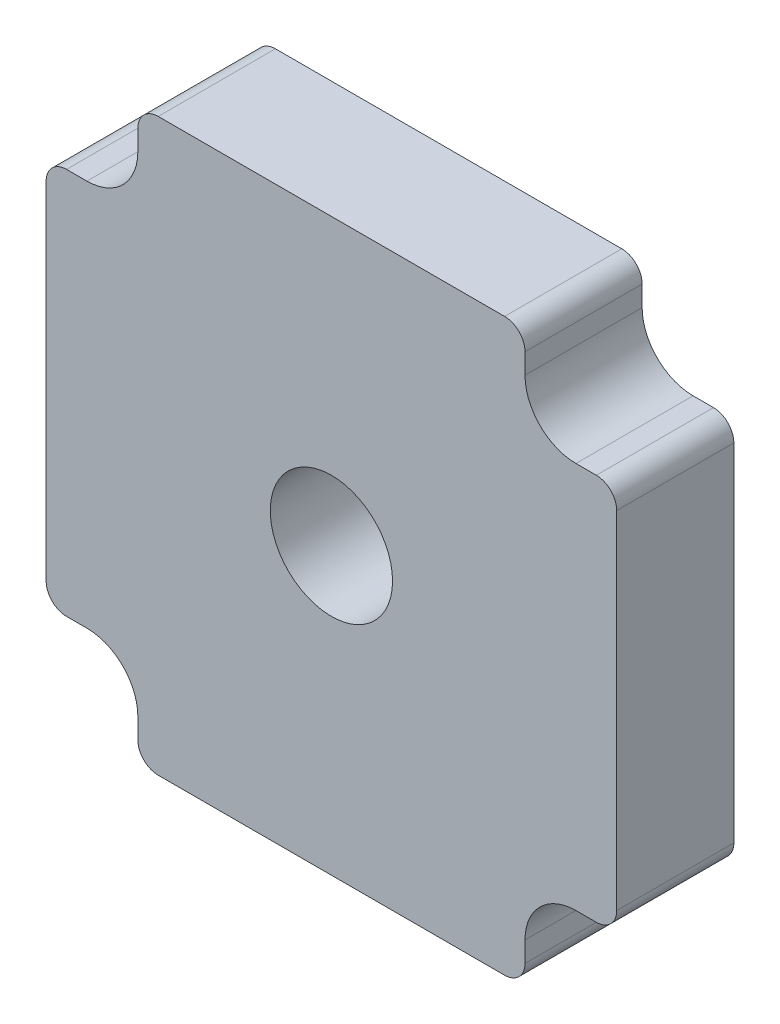
ISO-10303-21;
HEADER;
FILE_DESCRIPTION(('STEP AP214'),'2;1');
FILE_NAME('part.step','',(''),(''),'','','');
FILE_SCHEMA(('AUTOMOTIVE_DESIGN { 1 0 10303 214 1 1 1 1 }'));
ENDSEC;
DATA;
#1=APPLICATION_CONTEXT('core data for automotive mechanical design processes');
#2=APPLICATION_PROTOCOL_DEFINITION('international standard','automotive_design',2000,#1);
#3=PRODUCT_CONTEXT('',#1,'mechanical');
#4=PRODUCT('Part','Part','',(#3));
#5=PRODUCT_RELATED_PRODUCT_CATEGORY('part','',(#4));
#6=PRODUCT_DEFINITION_FORMATION('','',#4);
#7=PRODUCT_DEFINITION_CONTEXT('part definition',#1,'design');
#8=PRODUCT_DEFINITION('design','',#6,#7);
#9=PRODUCT_DEFINITION_SHAPE('','',#8);
#10=(LENGTH_UNIT() NAMED_UNIT(*) SI_UNIT(.MILLI.,.METRE.));
#11=(NAMED_UNIT(*) PLANE_ANGLE_UNIT() SI_UNIT($,.RADIAN.));
#12=(NAMED_UNIT(*) SI_UNIT($,.STERADIAN.) SOLID_ANGLE_UNIT());
#13=UNCERTAINTY_MEASURE_WITH_UNIT(LENGTH_MEASURE(1.E-05),#10,'distance_accuracy_value','');
#14=(GEOMETRIC_REPRESENTATION_CONTEXT(3) GLOBAL_UNCERTAINTY_ASSIGNED_CONTEXT((#13)) GLOBAL_UNIT_ASSIGNED_CONTEXT((#10,
#11,#12)) REPRESENTATION_CONTEXT('',''));
#15=CARTESIAN_POINT('',(0.,0.,0.));
#16=DIRECTION('',(0.,0.,1.));
#17=DIRECTION('',(1.,0.,0.));
#18=AXIS2_PLACEMENT_3D('',#15,#16,#17);
#19=CARTESIAN_POINT('',(-28.,-28.,11.5));
#20=DIRECTION('',(1.,0.,0.));
#21=DIRECTION('',(0.,0.,-1.));
#22=AXIS2_PLACEMENT_3D('',#19,#20,#21);
#23=PLANE('',#22);
#24=DIRECTION('',(0.,-1.,0.));
#25=VECTOR('',#24,1.);
#26=CARTESIAN_POINT('',(-28.,-28.,11.5));
#27=LINE('',#26,#25);
#28=CARTESIAN_POINT('',(-28.,16.9999999999999,11.5));
#29=VERTEX_POINT('',#28);
#30=CARTESIAN_POINT('',(-28.,-17.,11.5));
#31=VERTEX_POINT('',#30);
#32=EDGE_CURVE('E242',#29,#31,#27,.T.);
#33=ORIENTED_EDGE('',*,*,#32,.F.);
#34=DIRECTION('',(0.,0.,1.));
#35=VECTOR('',#34,1.);
#36=CARTESIAN_POINT('',(-28.,16.9999999999999,11.5));
#37=LINE('',#36,#35);
#38=CARTESIAN_POINT('',(-28.,16.9999999999999,0.));
#39=VERTEX_POINT('',#38);
#40=EDGE_CURVE('E317',#29,#39,#37,.F.);
#41=ORIENTED_EDGE('',*,*,#40,.T.);
#42=DIRECTION('',(0.,-1.,0.));
#43=VECTOR('',#42,1.);
#44=CARTESIAN_POINT('',(-28.,-28.,0.));
#45=LINE('',#44,#43);
#46=CARTESIAN_POINT('',(-28.,-17.,0.));
#47=VERTEX_POINT('',#46);
#48=EDGE_CURVE('E237',#39,#47,#45,.T.);
#49=ORIENTED_EDGE('',*,*,#48,.T.);
#50=DIRECTION('',(0.,0.,1.));
#51=VECTOR('',#50,1.);
#52=CARTESIAN_POINT('',(-28.,-17.,11.5));
#53=LINE('',#52,#51);
#54=EDGE_CURVE('E314',#47,#31,#53,.T.);
#55=ORIENTED_EDGE('',*,*,#54,.T.);
#56=EDGE_LOOP('',(#33,#41,#49,#55));
#57=FACE_BOUND('',#56,.T.);
#58=ADVANCED_FACE('F33',(#57),#23,.F.);
#59=CARTESIAN_POINT('',(28.,-28.,11.5));
#60=DIRECTION('',(0.,1.,0.));
#61=DIRECTION('',(-1.,0.,0.));
#62=AXIS2_PLACEMENT_3D('',#59,#60,#61);
#63=PLANE('',#62);
#64=DIRECTION('',(1.,0.,0.));
#65=VECTOR('',#64,1.);
#66=CARTESIAN_POINT('',(28.,-28.,11.5));
#67=LINE('',#66,#65);
#68=CARTESIAN_POINT('',(-17.,-28.,11.5));
#69=VERTEX_POINT('',#68);
#70=CARTESIAN_POINT('',(17.0000000000003,-28.,11.5));
#71=VERTEX_POINT('',#70);
#72=EDGE_CURVE('E245',#69,#71,#67,.T.);
#73=ORIENTED_EDGE('',*,*,#72,.F.);
#74=DIRECTION('',(0.,0.,1.));
#75=VECTOR('',#74,1.);
#76=CARTESIAN_POINT('',(-17.,-28.,11.5));
#77=LINE('',#76,#75);
#78=CARTESIAN_POINT('',(-17.,-28.,0.));
#79=VERTEX_POINT('',#78);
#80=EDGE_CURVE('E55',#69,#79,#77,.F.);
#81=ORIENTED_EDGE('',*,*,#80,.T.);
#82=DIRECTION('',(1.,0.,0.));
#83=VECTOR('',#82,1.);
#84=CARTESIAN_POINT('',(28.,-28.,0.));
#85=LINE('',#84,#83);
#86=CARTESIAN_POINT('',(17.0000000000003,-28.,0.));
#87=VERTEX_POINT('',#86);
#88=EDGE_CURVE('E255',#79,#87,#85,.T.);
#89=ORIENTED_EDGE('',*,*,#88,.T.);
#90=DIRECTION('',(0.,0.,1.));
#91=VECTOR('',#90,1.);
#92=CARTESIAN_POINT('',(17.0000000000003,-28.,11.5));
#93=LINE('',#92,#91);
#94=EDGE_CURVE('E344',#87,#71,#93,.T.);
#95=ORIENTED_EDGE('',*,*,#94,.T.);
#96=EDGE_LOOP('',(#73,#81,#89,#95));
#97=FACE_BOUND('',#96,.T.);
#98=ADVANCED_FACE('F434',(#97),#63,.F.);
#99=CARTESIAN_POINT('',(28.,-28.,11.5));
#100=DIRECTION('',(-1.,0.,0.));
#101=DIRECTION('',(0.,0.,1.));
#102=AXIS2_PLACEMENT_3D('',#99,#100,#101);
#103=PLANE('',#102);
#104=DIRECTION('',(0.,1.,0.));
#105=VECTOR('',#104,1.);
#106=CARTESIAN_POINT('',(28.,-28.,11.5));
#107=LINE('',#106,#105);
#108=CARTESIAN_POINT('',(28.,-16.9999999999997,11.5));
#109=VERTEX_POINT('',#108);
#110=CARTESIAN_POINT('',(28.,17.,11.5));
#111=VERTEX_POINT('',#110);
#112=EDGE_CURVE('E249',#109,#111,#107,.T.);
#113=ORIENTED_EDGE('',*,*,#112,.F.);
#114=DIRECTION('',(0.,0.,1.));
#115=VECTOR('',#114,1.);
#116=CARTESIAN_POINT('',(28.,-16.9999999999997,11.5));
#117=LINE('',#116,#115);
#118=CARTESIAN_POINT('',(28.,-16.9999999999997,0.));
#119=VERTEX_POINT('',#118);
#120=EDGE_CURVE('E358',#109,#119,#117,.F.);
#121=ORIENTED_EDGE('',*,*,#120,.T.);
#122=DIRECTION('',(0.,1.,0.));
#123=VECTOR('',#122,1.);
#124=CARTESIAN_POINT('',(28.,-28.,0.));
#125=LINE('',#124,#123);
#126=CARTESIAN_POINT('',(28.,17.,0.));
#127=VERTEX_POINT('',#126);
#128=EDGE_CURVE('E257',#119,#127,#125,.T.);
#129=ORIENTED_EDGE('',*,*,#128,.T.);
#130=DIRECTION('',(0.,0.,1.));
#131=VECTOR('',#130,1.);
#132=CARTESIAN_POINT('',(28.,17.,11.5));
#133=LINE('',#132,#131);
#134=EDGE_CURVE('E355',#127,#111,#133,.T.);
#135=ORIENTED_EDGE('',*,*,#134,.T.);
#136=EDGE_LOOP('',(#113,#121,#129,#135));
#137=FACE_BOUND('',#136,.T.);
#138=ADVANCED_FACE('F375',(#137),#103,.F.);
#139=CARTESIAN_POINT('',(28.,28.,11.5));
#140=DIRECTION('',(0.,-1.,0.));
#141=DIRECTION('',(1.,0.,0.));
#142=AXIS2_PLACEMENT_3D('',#139,#140,#141);
#143=PLANE('',#142);
#144=DIRECTION('',(-1.,0.,0.));
#145=VECTOR('',#144,1.);
#146=CARTESIAN_POINT('',(28.,28.,0.));
#147=LINE('',#146,#145);
#148=CARTESIAN_POINT('',(17.,28.,0.));
#149=VERTEX_POINT('',#148);
#150=CARTESIAN_POINT('',(-17.0000000000001,28.,0.));
#151=VERTEX_POINT('',#150);
#152=EDGE_CURVE('E246',#149,#151,#147,.T.);
#153=ORIENTED_EDGE('',*,*,#152,.T.);
#154=DIRECTION('',(0.,0.,1.));
#155=VECTOR('',#154,1.);
#156=CARTESIAN_POINT('',(-17.0000000000001,28.,11.5));
#157=LINE('',#156,#155);
#158=CARTESIAN_POINT('',(-17.0000000000001,28.,11.5));
#159=VERTEX_POINT('',#158);
#160=EDGE_CURVE('E336',#151,#159,#157,.T.);
#161=ORIENTED_EDGE('',*,*,#160,.T.);
#162=DIRECTION('',(-1.,0.,0.));
#163=VECTOR('',#162,1.);
#164=CARTESIAN_POINT('',(28.,28.,11.5));
#165=LINE('',#164,#163);
#166=CARTESIAN_POINT('',(17.,28.,11.5));
#167=VERTEX_POINT('',#166);
#168=EDGE_CURVE('E218',#167,#159,#165,.T.);
#169=ORIENTED_EDGE('',*,*,#168,.F.);
#170=DIRECTION('',(0.,0.,1.));
#171=VECTOR('',#170,1.);
#172=CARTESIAN_POINT('',(17.,28.,11.5));
#173=LINE('',#172,#171);
#174=EDGE_CURVE('E334',#167,#149,#173,.F.);
#175=ORIENTED_EDGE('',*,*,#174,.T.);
#176=EDGE_LOOP('',(#153,#161,#169,#175));
#177=FACE_BOUND('',#176,.T.);
#178=ADVANCED_FACE('F408',(#177),#143,.F.);
#179=CARTESIAN_POINT('',(0.,0.,11.5));
#180=DIRECTION('',(0.,0.,1.));
#181=DIRECTION('',(1.,0.,0.));
#182=AXIS2_PLACEMENT_3D('',#179,#180,#181);
#183=PLANE('',#182);
#184=CARTESIAN_POINT('',(0.,0.,11.5));
#185=DIRECTION('',(0.,0.,1.));
#186=DIRECTION('',(1.,0.,0.));
#187=AXIS2_PLACEMENT_3D('',#184,#185,#186);
#188=CIRCLE('',#187,6.);
#189=CARTESIAN_POINT('',(6.,0.,11.5));
#190=VERTEX_POINT('',#189);
#191=EDGE_CURVE('E648',#190,#190,#188,.T.);
#192=ORIENTED_EDGE('',*,*,#191,.F.);
#193=EDGE_LOOP('',(#192));
#194=FACE_BOUND('',#193,.T.);
#195=DIRECTION('',(1.,0.,0.));
#196=VECTOR('',#195,1.);
#197=CARTESIAN_POINT('',(-28.0000000000001,18.9999999999999,11.5));
#198=LINE('',#197,#196);
#199=CARTESIAN_POINT('',(-26.,18.9999999999999,11.5));
#200=VERTEX_POINT('',#199);
#201=CARTESIAN_POINT('',(-24.0000000000001,18.9999999999999,11.5));
#202=VERTEX_POINT('',#201);
#203=EDGE_CURVE('E224',#200,#202,#198,.T.);
#204=ORIENTED_EDGE('',*,*,#203,.F.);
#205=CARTESIAN_POINT('',(-26.,16.9999999999999,11.5));
#206=DIRECTION('',(0.,0.,1.));
#207=DIRECTION('',(1.,0.,0.));
#208=AXIS2_PLACEMENT_3D('',#205,#206,#207);
#209=CIRCLE('',#208,2.);
#210=EDGE_CURVE('E312',#200,#29,#209,.T.);
#211=ORIENTED_EDGE('',*,*,#210,.T.);
#212=ORIENTED_EDGE('',*,*,#32,.T.);
#213=CARTESIAN_POINT('',(-26.,-17.,11.5));
#214=DIRECTION('',(0.,0.,1.));
#215=DIRECTION('',(1.,0.,0.));
#216=AXIS2_PLACEMENT_3D('',#213,#214,#215);
#217=CIRCLE('',#216,2.);
#218=CARTESIAN_POINT('',(-26.,-19.,11.5));
#219=VERTEX_POINT('',#218);
#220=EDGE_CURVE('E307',#31,#219,#217,.T.);
#221=ORIENTED_EDGE('',*,*,#220,.T.);
#222=DIRECTION('',(-1.,0.,0.));
#223=VECTOR('',#222,1.);
#224=CARTESIAN_POINT('',(-19.,-19.,11.5));
#225=LINE('',#224,#223);
#226=CARTESIAN_POINT('',(-24.,-19.,11.5));
#227=VERTEX_POINT('',#226);
#228=EDGE_CURVE('E397',#227,#219,#225,.T.);
#229=ORIENTED_EDGE('',*,*,#228,.F.);
#230=CARTESIAN_POINT('',(-24.,-24.,11.5));
#231=DIRECTION('',(0.,0.,1.));
#232=DIRECTION('',(1.,0.,0.));
#233=AXIS2_PLACEMENT_3D('',#230,#231,#232);
#234=CIRCLE('',#233,5.);
#235=CARTESIAN_POINT('',(-19.,-24.,11.5));
#236=VERTEX_POINT('',#235);
#237=EDGE_CURVE('E281',#227,#236,#234,.F.);
#238=ORIENTED_EDGE('',*,*,#237,.T.);
#239=DIRECTION('',(0.,1.,0.));
#240=VECTOR('',#239,1.);
#241=CARTESIAN_POINT('',(-19.,-28.,11.5));
#242=LINE('',#241,#240);
#243=CARTESIAN_POINT('',(-19.,-26.,11.5));
#244=VERTEX_POINT('',#243);
#245=EDGE_CURVE('E392',#244,#236,#242,.T.);
#246=ORIENTED_EDGE('',*,*,#245,.F.);
#247=CARTESIAN_POINT('',(-17.,-26.,11.5));
#248=DIRECTION('',(0.,0.,1.));
#249=DIRECTION('',(1.,0.,0.));
#250=AXIS2_PLACEMENT_3D('',#247,#248,#249);
#251=CIRCLE('',#250,2.);
#252=EDGE_CURVE('E309',#244,#69,#251,.T.);
#253=ORIENTED_EDGE('',*,*,#252,.T.);
#254=ORIENTED_EDGE('',*,*,#72,.T.);
#255=CARTESIAN_POINT('',(17.0000000000003,-26.,11.5));
#256=DIRECTION('',(0.,0.,1.));
#257=DIRECTION('',(1.,0.,0.));
#258=AXIS2_PLACEMENT_3D('',#255,#256,#257);
#259=CIRCLE('',#258,2.);
#260=CARTESIAN_POINT('',(19.0000000000003,-26.,11.5));
#261=VERTEX_POINT('',#260);
#262=EDGE_CURVE('E305',#71,#261,#259,.T.);
#263=ORIENTED_EDGE('',*,*,#262,.T.);
#264=DIRECTION('',(0.,-1.,0.));
#265=VECTOR('',#264,1.);
#266=CARTESIAN_POINT('',(19.0000000000002,-18.9999999999998,11.5));
#267=LINE('',#266,#265);
#268=CARTESIAN_POINT('',(19.0000000000002,-23.9999999999998,11.5));
#269=VERTEX_POINT('',#268);
#270=EDGE_CURVE('E390',#269,#261,#267,.T.);
#271=ORIENTED_EDGE('',*,*,#270,.F.);
#272=CARTESIAN_POINT('',(24.0000000000002,-23.9999999999998,11.5));
#273=DIRECTION('',(0.,0.,1.));
#274=DIRECTION('',(1.,0.,0.));
#275=AXIS2_PLACEMENT_3D('',#272,#273,#274);
#276=CIRCLE('',#275,5.);
#277=CARTESIAN_POINT('',(24.0000000000002,-18.9999999999998,11.5));
#278=VERTEX_POINT('',#277);
#279=EDGE_CURVE('E286',#269,#278,#276,.F.);
#280=ORIENTED_EDGE('',*,*,#279,.T.);
#281=DIRECTION('',(-1.,0.,0.));
#282=VECTOR('',#281,1.);
#283=CARTESIAN_POINT('',(28.0000000000002,-18.9999999999997,11.5));
#284=LINE('',#283,#282);
#285=CARTESIAN_POINT('',(26.,-18.9999999999997,11.5));
#286=VERTEX_POINT('',#285);
#287=EDGE_CURVE('E378',#286,#278,#284,.T.);
#288=ORIENTED_EDGE('',*,*,#287,.F.);
#289=CARTESIAN_POINT('',(26.,-16.9999999999997,11.5));
#290=DIRECTION('',(0.,0.,1.));
#291=DIRECTION('',(1.,0.,0.));
#292=AXIS2_PLACEMENT_3D('',#289,#290,#291);
#293=CIRCLE('',#292,2.);
#294=EDGE_CURVE('E303',#286,#109,#293,.T.);
#295=ORIENTED_EDGE('',*,*,#294,.T.);
#296=ORIENTED_EDGE('',*,*,#112,.T.);
#297=CARTESIAN_POINT('',(26.,17.,11.5));
#298=DIRECTION('',(0.,0.,1.));
#299=DIRECTION('',(1.,0.,0.));
#300=AXIS2_PLACEMENT_3D('',#297,#298,#299);
#301=CIRCLE('',#300,2.);
#302=CARTESIAN_POINT('',(26.,19.,11.5));
#303=VERTEX_POINT('',#302);
#304=EDGE_CURVE('E301',#111,#303,#301,.T.);
#305=ORIENTED_EDGE('',*,*,#304,.T.);
#306=DIRECTION('',(1.,0.,0.));
#307=VECTOR('',#306,1.);
#308=CARTESIAN_POINT('',(19.,19.,11.5));
#309=LINE('',#308,#307);
#310=CARTESIAN_POINT('',(24.,19.,11.5));
#311=VERTEX_POINT('',#310);
#312=EDGE_CURVE('E234',#311,#303,#309,.T.);
#313=ORIENTED_EDGE('',*,*,#312,.F.);
#314=CARTESIAN_POINT('',(24.,24.,11.5));
#315=DIRECTION('',(0.,0.,1.));
#316=DIRECTION('',(1.,0.,0.));
#317=AXIS2_PLACEMENT_3D('',#314,#315,#316);
#318=CIRCLE('',#317,5.);
#319=CARTESIAN_POINT('',(19.,24.,11.5));
#320=VERTEX_POINT('',#319);
#321=EDGE_CURVE('E291',#311,#320,#318,.F.);
#322=ORIENTED_EDGE('',*,*,#321,.T.);
#323=DIRECTION('',(0.,-1.,0.));
#324=VECTOR('',#323,1.);
#325=CARTESIAN_POINT('',(19.,28.,11.5));
#326=LINE('',#325,#324);
#327=CARTESIAN_POINT('',(19.,26.,11.5));
#328=VERTEX_POINT('',#327);
#329=EDGE_CURVE('E238',#328,#320,#326,.T.);
#330=ORIENTED_EDGE('',*,*,#329,.F.);
#331=CARTESIAN_POINT('',(17.,26.,11.5));
#332=DIRECTION('',(0.,0.,1.));
#333=DIRECTION('',(1.,0.,0.));
#334=AXIS2_PLACEMENT_3D('',#331,#332,#333);
#335=CIRCLE('',#334,2.);
#336=EDGE_CURVE('E299',#328,#167,#335,.T.);
#337=ORIENTED_EDGE('',*,*,#336,.T.);
#338=ORIENTED_EDGE('',*,*,#168,.T.);
#339=CARTESIAN_POINT('',(-17.0000000000001,26.,11.5));
#340=DIRECTION('',(0.,0.,1.));
#341=DIRECTION('',(1.,0.,0.));
#342=AXIS2_PLACEMENT_3D('',#339,#340,#341);
#343=CIRCLE('',#342,2.);
#344=CARTESIAN_POINT('',(-19.0000000000001,26.,11.5));
#345=VERTEX_POINT('',#344);
#346=EDGE_CURVE('E222',#159,#345,#343,.T.);
#347=ORIENTED_EDGE('',*,*,#346,.T.);
#348=DIRECTION('',(0.,1.,0.));
#349=VECTOR('',#348,1.);
#350=CARTESIAN_POINT('',(-19.0000000000001,18.9999999999999,11.5));
#351=LINE('',#350,#349);
#352=CARTESIAN_POINT('',(-19.0000000000001,23.9999999999999,11.5));
#353=VERTEX_POINT('',#352);
#354=EDGE_CURVE('E214',#353,#345,#351,.T.);
#355=ORIENTED_EDGE('',*,*,#354,.F.);
#356=CARTESIAN_POINT('',(-24.0000000000001,23.9999999999999,11.5));
#357=DIRECTION('',(0.,0.,1.));
#358=DIRECTION('',(1.,0.,0.));
#359=AXIS2_PLACEMENT_3D('',#356,#357,#358);
#360=CIRCLE('',#359,5.);
#361=EDGE_CURVE('E197',#353,#202,#360,.F.);
#362=ORIENTED_EDGE('',*,*,#361,.T.);
#363=EDGE_LOOP('',(#204,#211,#212,#221,#229,#238,#246,#253,#254,#263,#271,#280,#288,#295,#296,
#305,#313,#322,#330,#337,#338,#347,#355,#362));
#364=FACE_BOUND('',#363,.T.);
#365=ADVANCED_FACE('F220',(#194,#364),#183,.T.);
#366=CARTESIAN_POINT('',(0.,0.,0.));
#367=DIRECTION('',(0.,0.,1.));
#368=DIRECTION('',(1.,0.,0.));
#369=AXIS2_PLACEMENT_3D('',#366,#367,#368);
#370=PLANE('',#369);
#371=CARTESIAN_POINT('',(0.,0.,0.));
#372=DIRECTION('',(0.,0.,1.));
#373=DIRECTION('',(1.,0.,0.));
#374=AXIS2_PLACEMENT_3D('',#371,#372,#373);
#375=CIRCLE('',#374,6.);
#376=CARTESIAN_POINT('',(6.,0.,0.));
#377=VERTEX_POINT('',#376);
#378=EDGE_CURVE('E400',#377,#377,#375,.T.);
#379=ORIENTED_EDGE('',*,*,#378,.T.);
#380=EDGE_LOOP('',(#379));
#381=FACE_BOUND('',#380,.T.);
#382=ORIENTED_EDGE('',*,*,#48,.F.);
#383=CARTESIAN_POINT('',(-26.,16.9999999999999,0.));
#384=DIRECTION('',(0.,0.,1.));
#385=DIRECTION('',(1.,0.,0.));
#386=AXIS2_PLACEMENT_3D('',#383,#384,#385);
#387=CIRCLE('',#386,2.);
#388=CARTESIAN_POINT('',(-26.,18.9999999999999,0.));
#389=VERTEX_POINT('',#388);
#390=EDGE_CURVE('E332',#39,#389,#387,.F.);
#391=ORIENTED_EDGE('',*,*,#390,.T.);
#392=DIRECTION('',(1.,0.,0.));
#393=VECTOR('',#392,1.);
#394=CARTESIAN_POINT('',(-28.0000000000001,18.9999999999999,0.));
#395=LINE('',#394,#393);
#396=CARTESIAN_POINT('',(-24.0000000000001,18.9999999999999,0.));
#397=VERTEX_POINT('',#396);
#398=EDGE_CURVE('E223',#389,#397,#395,.T.);
#399=ORIENTED_EDGE('',*,*,#398,.T.);
#400=CARTESIAN_POINT('',(-24.0000000000001,23.9999999999999,0.));
#401=DIRECTION('',(0.,0.,1.));
#402=DIRECTION('',(1.,0.,0.));
#403=AXIS2_PLACEMENT_3D('',#400,#401,#402);
#404=CIRCLE('',#403,5.);
#405=CARTESIAN_POINT('',(-19.0000000000001,23.9999999999999,0.));
#406=VERTEX_POINT('',#405);
#407=EDGE_CURVE('E207',#397,#406,#404,.T.);
#408=ORIENTED_EDGE('',*,*,#407,.T.);
#409=DIRECTION('',(0.,1.,0.));
#410=VECTOR('',#409,1.);
#411=CARTESIAN_POINT('',(-19.0000000000001,18.9999999999999,0.));
#412=LINE('',#411,#410);
#413=CARTESIAN_POINT('',(-19.0000000000001,26.,0.));
#414=VERTEX_POINT('',#413);
#415=EDGE_CURVE('E217',#406,#414,#412,.T.);
#416=ORIENTED_EDGE('',*,*,#415,.T.);
#417=CARTESIAN_POINT('',(-17.0000000000001,26.,0.));
#418=DIRECTION('',(0.,0.,1.));
#419=DIRECTION('',(1.,0.,0.));
#420=AXIS2_PLACEMENT_3D('',#417,#418,#419);
#421=CIRCLE('',#420,2.);
#422=EDGE_CURVE('E330',#414,#151,#421,.F.);
#423=ORIENTED_EDGE('',*,*,#422,.T.);
#424=ORIENTED_EDGE('',*,*,#152,.F.);
#425=CARTESIAN_POINT('',(17.,26.,0.));
#426=DIRECTION('',(0.,0.,1.));
#427=DIRECTION('',(1.,0.,0.));
#428=AXIS2_PLACEMENT_3D('',#425,#426,#427);
#429=CIRCLE('',#428,2.);
#430=CARTESIAN_POINT('',(19.,26.,0.));
#431=VERTEX_POINT('',#430);
#432=EDGE_CURVE('E319',#149,#431,#429,.F.);
#433=ORIENTED_EDGE('',*,*,#432,.T.);
#434=DIRECTION('',(0.,-1.,0.));
#435=VECTOR('',#434,1.);
#436=CARTESIAN_POINT('',(19.,28.,0.));
#437=LINE('',#436,#435);
#438=CARTESIAN_POINT('',(19.,24.,0.));
#439=VERTEX_POINT('',#438);
#440=EDGE_CURVE('E231',#431,#439,#437,.T.);
#441=ORIENTED_EDGE('',*,*,#440,.T.);
#442=CARTESIAN_POINT('',(24.,24.,0.));
#443=DIRECTION('',(0.,0.,1.));
#444=DIRECTION('',(1.,0.,0.));
#445=AXIS2_PLACEMENT_3D('',#442,#443,#444);
#446=CIRCLE('',#445,5.);
#447=CARTESIAN_POINT('',(24.,19.,0.));
#448=VERTEX_POINT('',#447);
#449=EDGE_CURVE('E294',#439,#448,#446,.T.);
#450=ORIENTED_EDGE('',*,*,#449,.T.);
#451=DIRECTION('',(1.,0.,0.));
#452=VECTOR('',#451,1.);
#453=CARTESIAN_POINT('',(19.,19.,0.));
#454=LINE('',#453,#452);
#455=CARTESIAN_POINT('',(26.,19.,0.));
#456=VERTEX_POINT('',#455);
#457=EDGE_CURVE('E233',#448,#456,#454,.T.);
#458=ORIENTED_EDGE('',*,*,#457,.T.);
#459=CARTESIAN_POINT('',(26.,17.,0.));
#460=DIRECTION('',(0.,0.,1.));
#461=DIRECTION('',(1.,0.,0.));
#462=AXIS2_PLACEMENT_3D('',#459,#460,#461);
#463=CIRCLE('',#462,2.);
#464=EDGE_CURVE('E321',#456,#127,#463,.F.);
#465=ORIENTED_EDGE('',*,*,#464,.T.);
#466=ORIENTED_EDGE('',*,*,#128,.F.);
#467=CARTESIAN_POINT('',(26.,-16.9999999999997,0.));
#468=DIRECTION('',(0.,0.,1.));
#469=DIRECTION('',(1.,0.,0.));
#470=AXIS2_PLACEMENT_3D('',#467,#468,#469);
#471=CIRCLE('',#470,2.);
#472=CARTESIAN_POINT('',(26.,-18.9999999999997,0.));
#473=VERTEX_POINT('',#472);
#474=EDGE_CURVE('E323',#119,#473,#471,.F.);
#475=ORIENTED_EDGE('',*,*,#474,.T.);
#476=DIRECTION('',(-1.,0.,0.));
#477=VECTOR('',#476,1.);
#478=CARTESIAN_POINT('',(28.0000000000002,-18.9999999999997,0.));
#479=LINE('',#478,#477);
#480=CARTESIAN_POINT('',(24.0000000000002,-18.9999999999998,0.));
#481=VERTEX_POINT('',#480);
#482=EDGE_CURVE('E386',#473,#481,#479,.T.);
#483=ORIENTED_EDGE('',*,*,#482,.T.);
#484=CARTESIAN_POINT('',(24.0000000000002,-23.9999999999998,0.));
#485=DIRECTION('',(0.,0.,1.));
#486=DIRECTION('',(1.,0.,0.));
#487=AXIS2_PLACEMENT_3D('',#484,#485,#486);
#488=CIRCLE('',#487,5.);
#489=CARTESIAN_POINT('',(19.0000000000002,-23.9999999999998,0.));
#490=VERTEX_POINT('',#489);
#491=EDGE_CURVE('E289',#481,#490,#488,.T.);
#492=ORIENTED_EDGE('',*,*,#491,.T.);
#493=DIRECTION('',(0.,-1.,0.));
#494=VECTOR('',#493,1.);
#495=CARTESIAN_POINT('',(19.0000000000002,-18.9999999999998,0.));
#496=LINE('',#495,#494);
#497=CARTESIAN_POINT('',(19.0000000000003,-26.,0.));
#498=VERTEX_POINT('',#497);
#499=EDGE_CURVE('E389',#490,#498,#496,.T.);
#500=ORIENTED_EDGE('',*,*,#499,.T.);
#501=CARTESIAN_POINT('',(17.0000000000003,-26.,0.));
#502=DIRECTION('',(0.,0.,1.));
#503=DIRECTION('',(1.,0.,0.));
#504=AXIS2_PLACEMENT_3D('',#501,#502,#503);
#505=CIRCLE('',#504,2.);
#506=EDGE_CURVE('E48',#498,#87,#505,.F.);
#507=ORIENTED_EDGE('',*,*,#506,.T.);
#508=ORIENTED_EDGE('',*,*,#88,.F.);
#509=CARTESIAN_POINT('',(-17.,-26.,0.));
#510=DIRECTION('',(0.,0.,1.));
#511=DIRECTION('',(1.,0.,0.));
#512=AXIS2_PLACEMENT_3D('',#509,#510,#511);
#513=CIRCLE('',#512,2.);
#514=CARTESIAN_POINT('',(-19.,-26.,0.));
#515=VERTEX_POINT('',#514);
#516=EDGE_CURVE('E328',#79,#515,#513,.F.);
#517=ORIENTED_EDGE('',*,*,#516,.T.);
#518=DIRECTION('',(0.,1.,0.));
#519=VECTOR('',#518,1.);
#520=CARTESIAN_POINT('',(-19.,-28.,0.));
#521=LINE('',#520,#519);
#522=CARTESIAN_POINT('',(-19.,-24.,0.));
#523=VERTEX_POINT('',#522);
#524=EDGE_CURVE('E458',#515,#523,#521,.T.);
#525=ORIENTED_EDGE('',*,*,#524,.T.);
#526=CARTESIAN_POINT('',(-24.,-24.,0.));
#527=DIRECTION('',(0.,0.,1.));
#528=DIRECTION('',(1.,0.,0.));
#529=AXIS2_PLACEMENT_3D('',#526,#527,#528);
#530=CIRCLE('',#529,5.);
#531=CARTESIAN_POINT('',(-24.,-19.,0.));
#532=VERTEX_POINT('',#531);
#533=EDGE_CURVE('E284',#523,#532,#530,.T.);
#534=ORIENTED_EDGE('',*,*,#533,.T.);
#535=DIRECTION('',(-1.,0.,0.));
#536=VECTOR('',#535,1.);
#537=CARTESIAN_POINT('',(-19.,-19.,0.));
#538=LINE('',#537,#536);
#539=CARTESIAN_POINT('',(-26.,-19.,0.));
#540=VERTEX_POINT('',#539);
#541=EDGE_CURVE('E227',#532,#540,#538,.T.);
#542=ORIENTED_EDGE('',*,*,#541,.T.);
#543=CARTESIAN_POINT('',(-26.,-17.,0.));
#544=DIRECTION('',(0.,0.,1.));
#545=DIRECTION('',(1.,0.,0.));
#546=AXIS2_PLACEMENT_3D('',#543,#544,#545);
#547=CIRCLE('',#546,2.);
#548=EDGE_CURVE('E326',#540,#47,#547,.F.);
#549=ORIENTED_EDGE('',*,*,#548,.T.);
#550=EDGE_LOOP('',(#382,#391,#399,#408,#416,#423,#424,#433,#441,#450,#458,#465,#466,#475,#483,
#492,#500,#507,#508,#517,#525,#534,#542,#549));
#551=FACE_BOUND('',#550,.T.);
#552=ADVANCED_FACE('F368',(#381,#551),#370,.F.);
#553=CARTESIAN_POINT('',(19.,19.,0.));
#554=DIRECTION('',(0.,-1.,0.));
#555=DIRECTION('',(0.,0.,-1.));
#556=AXIS2_PLACEMENT_3D('',#553,#554,#555);
#557=PLANE('',#556);
#558=ORIENTED_EDGE('',*,*,#312,.T.);
#559=DIRECTION('',(0.,0.,1.));
#560=VECTOR('',#559,1.);
#561=CARTESIAN_POINT('',(26.,19.,0.));
#562=LINE('',#561,#560);
#563=EDGE_CURVE('E41',#303,#456,#562,.F.);
#564=ORIENTED_EDGE('',*,*,#563,.T.);
#565=ORIENTED_EDGE('',*,*,#457,.F.);
#566=DIRECTION('',(0.,0.,1.));
#567=VECTOR('',#566,1.);
#568=CARTESIAN_POINT('',(24.,19.,11.5));
#569=LINE('',#568,#567);
#570=EDGE_CURVE('E275',#448,#311,#569,.T.);
#571=ORIENTED_EDGE('',*,*,#570,.T.);
#572=EDGE_LOOP('',(#558,#564,#565,#571));
#573=FACE_BOUND('',#572,.T.);
#574=ADVANCED_FACE('F362',(#573),#557,.F.);
#575=CARTESIAN_POINT('',(19.,28.,0.));
#576=DIRECTION('',(-1.,0.,0.));
#577=DIRECTION('',(0.,0.,1.));
#578=AXIS2_PLACEMENT_3D('',#575,#576,#577);
#579=PLANE('',#578);
#580=ORIENTED_EDGE('',*,*,#440,.F.);
#581=DIRECTION('',(0.,0.,1.));
#582=VECTOR('',#581,1.);
#583=CARTESIAN_POINT('',(19.,26.,0.));
#584=LINE('',#583,#582);
#585=EDGE_CURVE('E11',#431,#328,#584,.T.);
#586=ORIENTED_EDGE('',*,*,#585,.T.);
#587=ORIENTED_EDGE('',*,*,#329,.T.);
#588=DIRECTION('',(0.,0.,1.));
#589=VECTOR('',#588,1.);
#590=CARTESIAN_POINT('',(19.,24.,0.));
#591=LINE('',#590,#589);
#592=EDGE_CURVE('E208',#320,#439,#591,.F.);
#593=ORIENTED_EDGE('',*,*,#592,.T.);
#594=EDGE_LOOP('',(#580,#586,#587,#593));
#595=FACE_BOUND('',#594,.T.);
#596=ADVANCED_FACE('F416',(#595),#579,.F.);
#597=CARTESIAN_POINT('',(-19.0000000000001,18.9999999999999,0.));
#598=DIRECTION('',(1.,0.,0.));
#599=DIRECTION('',(0.,1.,0.));
#600=AXIS2_PLACEMENT_3D('',#597,#598,#599);
#601=PLANE('',#600);
#602=ORIENTED_EDGE('',*,*,#354,.T.);
#603=DIRECTION('',(0.,0.,1.));
#604=VECTOR('',#603,1.);
#605=CARTESIAN_POINT('',(-19.0000000000001,26.,0.));
#606=LINE('',#605,#604);
#607=EDGE_CURVE('E339',#345,#414,#606,.F.);
#608=ORIENTED_EDGE('',*,*,#607,.T.);
#609=ORIENTED_EDGE('',*,*,#415,.F.);
#610=DIRECTION('',(0.,0.,1.));
#611=VECTOR('',#610,1.);
#612=CARTESIAN_POINT('',(-19.0000000000001,23.9999999999999,11.5));
#613=LINE('',#612,#611);
#614=EDGE_CURVE('E201',#406,#353,#613,.T.);
#615=ORIENTED_EDGE('',*,*,#614,.T.);
#616=EDGE_LOOP('',(#602,#608,#609,#615));
#617=FACE_BOUND('',#616,.T.);
#618=ADVANCED_FACE('F213',(#617),#601,.F.);
#619=CARTESIAN_POINT('',(-28.0000000000001,18.9999999999999,0.));
#620=DIRECTION('',(0.,-1.,0.));
#621=DIRECTION('',(1.,0.,0.));
#622=AXIS2_PLACEMENT_3D('',#619,#620,#621);
#623=PLANE('',#622);
#624=ORIENTED_EDGE('',*,*,#398,.F.);
#625=DIRECTION('',(0.,0.,1.));
#626=VECTOR('',#625,1.);
#627=CARTESIAN_POINT('',(-26.,18.9999999999999,0.));
#628=LINE('',#627,#626);
#629=EDGE_CURVE('E296',#389,#200,#628,.T.);
#630=ORIENTED_EDGE('',*,*,#629,.T.);
#631=ORIENTED_EDGE('',*,*,#203,.T.);
#632=DIRECTION('',(0.,0.,1.));
#633=VECTOR('',#632,1.);
#634=CARTESIAN_POINT('',(-24.0000000000001,18.9999999999999,0.));
#635=LINE('',#634,#633);
#636=EDGE_CURVE('E203',#202,#397,#635,.F.);
#637=ORIENTED_EDGE('',*,*,#636,.T.);
#638=EDGE_LOOP('',(#624,#630,#631,#637));
#639=FACE_BOUND('',#638,.T.);
#640=ADVANCED_FACE('F477',(#639),#623,.F.);
#641=CARTESIAN_POINT('',(19.0000000000002,-18.9999999999998,0.));
#642=DIRECTION('',(-1.,0.,0.));
#643=DIRECTION('',(0.,-1.,0.));
#644=AXIS2_PLACEMENT_3D('',#641,#642,#643);
#645=PLANE('',#644);
#646=ORIENTED_EDGE('',*,*,#270,.T.);
#647=DIRECTION('',(0.,0.,1.));
#648=VECTOR('',#647,1.);
#649=CARTESIAN_POINT('',(19.0000000000003,-26.,0.));
#650=LINE('',#649,#648);
#651=EDGE_CURVE('E350',#261,#498,#650,.F.);
#652=ORIENTED_EDGE('',*,*,#651,.T.);
#653=ORIENTED_EDGE('',*,*,#499,.F.);
#654=DIRECTION('',(0.,0.,1.));
#655=VECTOR('',#654,1.);
#656=CARTESIAN_POINT('',(19.0000000000002,-23.9999999999998,11.5));
#657=LINE('',#656,#655);
#658=EDGE_CURVE('E269',#490,#269,#657,.T.);
#659=ORIENTED_EDGE('',*,*,#658,.T.);
#660=EDGE_LOOP('',(#646,#652,#653,#659));
#661=FACE_BOUND('',#660,.T.);
#662=ADVANCED_FACE('F479',(#661),#645,.F.);
#663=CARTESIAN_POINT('',(28.0000000000002,-18.9999999999997,0.));
#664=DIRECTION('',(0.,1.,0.));
#665=DIRECTION('',(-1.,0.,0.));
#666=AXIS2_PLACEMENT_3D('',#663,#664,#665);
#667=PLANE('',#666);
#668=ORIENTED_EDGE('',*,*,#482,.F.);
#669=DIRECTION('',(0.,0.,1.));
#670=VECTOR('',#669,1.);
#671=CARTESIAN_POINT('',(26.,-18.9999999999997,0.));
#672=LINE('',#671,#670);
#673=EDGE_CURVE('E352',#473,#286,#672,.T.);
#674=ORIENTED_EDGE('',*,*,#673,.T.);
#675=ORIENTED_EDGE('',*,*,#287,.T.);
#676=DIRECTION('',(0.,0.,1.));
#677=VECTOR('',#676,1.);
#678=CARTESIAN_POINT('',(24.0000000000002,-18.9999999999998,0.));
#679=LINE('',#678,#677);
#680=EDGE_CURVE('E272',#278,#481,#679,.F.);
#681=ORIENTED_EDGE('',*,*,#680,.T.);
#682=EDGE_LOOP('',(#668,#674,#675,#681));
#683=FACE_BOUND('',#682,.T.);
#684=ADVANCED_FACE('F385',(#683),#667,.F.);
#685=CARTESIAN_POINT('',(-19.,-19.,0.));
#686=DIRECTION('',(0.,1.,0.));
#687=DIRECTION('',(0.,0.,1.));
#688=AXIS2_PLACEMENT_3D('',#685,#686,#687);
#689=PLANE('',#688);
#690=ORIENTED_EDGE('',*,*,#228,.T.);
#691=DIRECTION('',(0.,0.,1.));
#692=VECTOR('',#691,1.);
#693=CARTESIAN_POINT('',(-26.,-19.,0.));
#694=LINE('',#693,#692);
#695=EDGE_CURVE('E348',#219,#540,#694,.F.);
#696=ORIENTED_EDGE('',*,*,#695,.T.);
#697=ORIENTED_EDGE('',*,*,#541,.F.);
#698=DIRECTION('',(0.,0.,1.));
#699=VECTOR('',#698,1.);
#700=CARTESIAN_POINT('',(-24.,-19.,11.5));
#701=LINE('',#700,#699);
#702=EDGE_CURVE('E263',#532,#227,#701,.T.);
#703=ORIENTED_EDGE('',*,*,#702,.T.);
#704=EDGE_LOOP('',(#690,#696,#697,#703));
#705=FACE_BOUND('',#704,.T.);
#706=ADVANCED_FACE('F461',(#705),#689,.F.);
#707=CARTESIAN_POINT('',(-19.,-28.,0.));
#708=DIRECTION('',(1.,0.,0.));
#709=DIRECTION('',(0.,0.,-1.));
#710=AXIS2_PLACEMENT_3D('',#707,#708,#709);
#711=PLANE('',#710);
#712=ORIENTED_EDGE('',*,*,#524,.F.);
#713=DIRECTION('',(0.,0.,1.));
#714=VECTOR('',#713,1.);
#715=CARTESIAN_POINT('',(-19.,-26.,0.));
#716=LINE('',#715,#714);
#717=EDGE_CURVE('E341',#515,#244,#716,.T.);
#718=ORIENTED_EDGE('',*,*,#717,.T.);
#719=ORIENTED_EDGE('',*,*,#245,.T.);
#720=DIRECTION('',(0.,0.,1.));
#721=VECTOR('',#720,1.);
#722=CARTESIAN_POINT('',(-19.,-24.,0.));
#723=LINE('',#722,#721);
#724=EDGE_CURVE('E266',#236,#523,#723,.F.);
#725=ORIENTED_EDGE('',*,*,#724,.T.);
#726=EDGE_LOOP('',(#712,#718,#719,#725));
#727=FACE_BOUND('',#726,.T.);
#728=ADVANCED_FACE('F446',(#727),#711,.F.);
#729=CARTESIAN_POINT('',(-24.0000000000001,23.9999999999999,0.));
#730=DIRECTION('',(0.,0.,-1.));
#731=DIRECTION('',(-1.,0.,0.));
#732=AXIS2_PLACEMENT_3D('',#729,#730,#731);
#733=CYLINDRICAL_SURFACE('',#732,5.);
#734=ORIENTED_EDGE('',*,*,#407,.F.);
#735=ORIENTED_EDGE('',*,*,#636,.F.);
#736=ORIENTED_EDGE('',*,*,#361,.F.);
#737=ORIENTED_EDGE('',*,*,#614,.F.);
#738=EDGE_LOOP('',(#734,#735,#736,#737));
#739=FACE_BOUND('',#738,.T.);
#740=ADVANCED_FACE('F200',(#739),#733,.F.);
#741=CARTESIAN_POINT('',(-24.,-24.,0.));
#742=DIRECTION('',(0.,0.,-1.));
#743=DIRECTION('',(-1.,0.,0.));
#744=AXIS2_PLACEMENT_3D('',#741,#742,#743);
#745=CYLINDRICAL_SURFACE('',#744,5.);
#746=ORIENTED_EDGE('',*,*,#533,.F.);
#747=ORIENTED_EDGE('',*,*,#724,.F.);
#748=ORIENTED_EDGE('',*,*,#237,.F.);
#749=ORIENTED_EDGE('',*,*,#702,.F.);
#750=EDGE_LOOP('',(#746,#747,#748,#749));
#751=FACE_BOUND('',#750,.T.);
#752=ADVANCED_FACE('F430',(#751),#745,.F.);
#753=CARTESIAN_POINT('',(24.0000000000002,-23.9999999999998,0.));
#754=DIRECTION('',(0.,0.,-1.));
#755=DIRECTION('',(-1.,0.,0.));
#756=AXIS2_PLACEMENT_3D('',#753,#754,#755);
#757=CYLINDRICAL_SURFACE('',#756,5.);
#758=ORIENTED_EDGE('',*,*,#491,.F.);
#759=ORIENTED_EDGE('',*,*,#680,.F.);
#760=ORIENTED_EDGE('',*,*,#279,.F.);
#761=ORIENTED_EDGE('',*,*,#658,.F.);
#762=EDGE_LOOP('',(#758,#759,#760,#761));
#763=FACE_BOUND('',#762,.T.);
#764=ADVANCED_FACE('F422',(#763),#757,.F.);
#765=CARTESIAN_POINT('',(24.,24.,0.));
#766=DIRECTION('',(0.,0.,-1.));
#767=DIRECTION('',(-1.,0.,0.));
#768=AXIS2_PLACEMENT_3D('',#765,#766,#767);
#769=CYLINDRICAL_SURFACE('',#768,5.);
#770=ORIENTED_EDGE('',*,*,#449,.F.);
#771=ORIENTED_EDGE('',*,*,#592,.F.);
#772=ORIENTED_EDGE('',*,*,#321,.F.);
#773=ORIENTED_EDGE('',*,*,#570,.F.);
#774=EDGE_LOOP('',(#770,#771,#772,#773));
#775=FACE_BOUND('',#774,.T.);
#776=ADVANCED_FACE('F419',(#775),#769,.F.);
#777=CARTESIAN_POINT('',(-26.,16.9999999999999,0.));
#778=DIRECTION('',(0.,0.,1.));
#779=DIRECTION('',(1.,0.,0.));
#780=AXIS2_PLACEMENT_3D('',#777,#778,#779);
#781=CYLINDRICAL_SURFACE('',#780,2.);
#782=ORIENTED_EDGE('',*,*,#390,.F.);
#783=ORIENTED_EDGE('',*,*,#40,.F.);
#784=ORIENTED_EDGE('',*,*,#210,.F.);
#785=ORIENTED_EDGE('',*,*,#629,.F.);
#786=EDGE_LOOP('',(#782,#783,#784,#785));
#787=FACE_BOUND('',#786,.T.);
#788=ADVANCED_FACE('F421',(#787),#781,.T.);
#789=CARTESIAN_POINT('',(-17.0000000000001,26.,11.5));
#790=DIRECTION('',(0.,0.,1.));
#791=DIRECTION('',(1.,0.,0.));
#792=AXIS2_PLACEMENT_3D('',#789,#790,#791);
#793=CYLINDRICAL_SURFACE('',#792,2.);
#794=ORIENTED_EDGE('',*,*,#422,.F.);
#795=ORIENTED_EDGE('',*,*,#607,.F.);
#796=ORIENTED_EDGE('',*,*,#346,.F.);
#797=ORIENTED_EDGE('',*,*,#160,.F.);
#798=EDGE_LOOP('',(#794,#795,#796,#797));
#799=FACE_BOUND('',#798,.T.);
#800=ADVANCED_FACE('F405',(#799),#793,.T.);
#801=CARTESIAN_POINT('',(-17.,-26.,0.));
#802=DIRECTION('',(0.,0.,1.));
#803=DIRECTION('',(1.,0.,0.));
#804=AXIS2_PLACEMENT_3D('',#801,#802,#803);
#805=CYLINDRICAL_SURFACE('',#804,2.);
#806=ORIENTED_EDGE('',*,*,#516,.F.);
#807=ORIENTED_EDGE('',*,*,#80,.F.);
#808=ORIENTED_EDGE('',*,*,#252,.F.);
#809=ORIENTED_EDGE('',*,*,#717,.F.);
#810=EDGE_LOOP('',(#806,#807,#808,#809));
#811=FACE_BOUND('',#810,.T.);
#812=ADVANCED_FACE('F582',(#811),#805,.T.);
#813=CARTESIAN_POINT('',(-26.,-17.,11.5));
#814=DIRECTION('',(0.,0.,1.));
#815=DIRECTION('',(1.,0.,0.));
#816=AXIS2_PLACEMENT_3D('',#813,#814,#815);
#817=CYLINDRICAL_SURFACE('',#816,2.);
#818=ORIENTED_EDGE('',*,*,#548,.F.);
#819=ORIENTED_EDGE('',*,*,#695,.F.);
#820=ORIENTED_EDGE('',*,*,#220,.F.);
#821=ORIENTED_EDGE('',*,*,#54,.F.);
#822=EDGE_LOOP('',(#818,#819,#820,#821));
#823=FACE_BOUND('',#822,.T.);
#824=ADVANCED_FACE('F470',(#823),#817,.T.);
#825=CARTESIAN_POINT('',(17.0000000000003,-26.,11.5));
#826=DIRECTION('',(0.,0.,1.));
#827=DIRECTION('',(1.,0.,0.));
#828=AXIS2_PLACEMENT_3D('',#825,#826,#827);
#829=CYLINDRICAL_SURFACE('',#828,2.);
#830=ORIENTED_EDGE('',*,*,#506,.F.);
#831=ORIENTED_EDGE('',*,*,#651,.F.);
#832=ORIENTED_EDGE('',*,*,#262,.F.);
#833=ORIENTED_EDGE('',*,*,#94,.F.);
#834=EDGE_LOOP('',(#830,#831,#832,#833));
#835=FACE_BOUND('',#834,.T.);
#836=ADVANCED_FACE('F600',(#835),#829,.T.);
#837=CARTESIAN_POINT('',(26.,-16.9999999999997,0.));
#838=DIRECTION('',(0.,0.,1.));
#839=DIRECTION('',(1.,0.,0.));
#840=AXIS2_PLACEMENT_3D('',#837,#838,#839);
#841=CYLINDRICAL_SURFACE('',#840,2.);
#842=ORIENTED_EDGE('',*,*,#474,.F.);
#843=ORIENTED_EDGE('',*,*,#120,.F.);
#844=ORIENTED_EDGE('',*,*,#294,.F.);
#845=ORIENTED_EDGE('',*,*,#673,.F.);
#846=EDGE_LOOP('',(#842,#843,#844,#845));
#847=FACE_BOUND('',#846,.T.);
#848=ADVANCED_FACE('F382',(#847),#841,.T.);
#849=CARTESIAN_POINT('',(26.,17.,11.5));
#850=DIRECTION('',(0.,0.,1.));
#851=DIRECTION('',(1.,0.,0.));
#852=AXIS2_PLACEMENT_3D('',#849,#850,#851);
#853=CYLINDRICAL_SURFACE('',#852,2.);
#854=ORIENTED_EDGE('',*,*,#464,.F.);
#855=ORIENTED_EDGE('',*,*,#563,.F.);
#856=ORIENTED_EDGE('',*,*,#304,.F.);
#857=ORIENTED_EDGE('',*,*,#134,.F.);
#858=EDGE_LOOP('',(#854,#855,#856,#857));
#859=FACE_BOUND('',#858,.T.);
#860=ADVANCED_FACE('F372',(#859),#853,.T.);
#861=CARTESIAN_POINT('',(17.,26.,0.));
#862=DIRECTION('',(0.,0.,1.));
#863=DIRECTION('',(1.,0.,0.));
#864=AXIS2_PLACEMENT_3D('',#861,#862,#863);
#865=CYLINDRICAL_SURFACE('',#864,2.);
#866=ORIENTED_EDGE('',*,*,#432,.F.);
#867=ORIENTED_EDGE('',*,*,#174,.F.);
#868=ORIENTED_EDGE('',*,*,#336,.F.);
#869=ORIENTED_EDGE('',*,*,#585,.F.);
#870=EDGE_LOOP('',(#866,#867,#868,#869));
#871=FACE_BOUND('',#870,.T.);
#872=ADVANCED_FACE('F35',(#871),#865,.T.);
#873=CARTESIAN_POINT('',(0.,0.,0.));
#874=DIRECTION('',(0.,0.,1.));
#875=DIRECTION('',(1.,0.,0.));
#876=AXIS2_PLACEMENT_3D('',#873,#874,#875);
#877=CYLINDRICAL_SURFACE('',#876,6.);
#878=ORIENTED_EDGE('',*,*,#378,.F.);
#879=EDGE_LOOP('',(#878));
#880=FACE_BOUND('',#879,.T.);
#881=ORIENTED_EDGE('',*,*,#191,.T.);
#882=EDGE_LOOP('',(#881));
#883=FACE_BOUND('',#882,.T.);
#884=ADVANCED_FACE('F631',(#880,#883),#877,.F.);
#885=CLOSED_SHELL('',(#58,#98,#138,#178,#365,#552,#574,#596,#618,#640,#662,#684,#706,#728,#740,
#752,#764,#776,#788,#800,#812,#824,#836,#848,#860,#872,#884));
#886=MANIFOLD_SOLID_BREP('B2',#885);
#887=ADVANCED_BREP_SHAPE_REPRESENTATION('',(#18,#886),#14);
#888=SHAPE_DEFINITION_REPRESENTATION(#9,#887);
ENDSEC;
END-ISO-10303-21;
